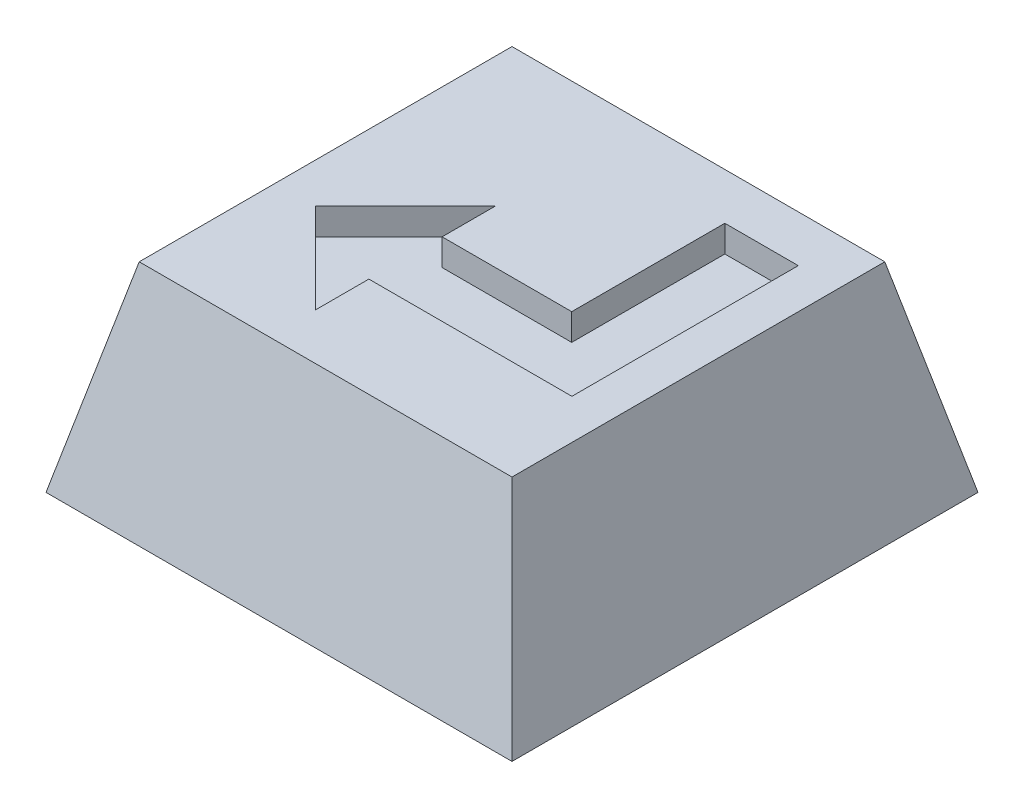
ISO-10303-21;
HEADER;
FILE_DESCRIPTION(('STEP AP214'),'2;1');
FILE_NAME('part.step','',(''),(''),'','','');
FILE_SCHEMA(('AUTOMOTIVE_DESIGN { 1 0 10303 214 1 1 1 1 }'));
ENDSEC;
DATA;
#1=APPLICATION_CONTEXT('core data for automotive mechanical design processes');
#2=APPLICATION_PROTOCOL_DEFINITION('international standard','automotive_design',2000,#1);
#3=PRODUCT_CONTEXT('',#1,'mechanical');
#4=PRODUCT('Part','Part','',(#3));
#5=PRODUCT_RELATED_PRODUCT_CATEGORY('part','',(#4));
#6=PRODUCT_DEFINITION_FORMATION('','',#4);
#7=PRODUCT_DEFINITION_CONTEXT('part definition',#1,'design');
#8=PRODUCT_DEFINITION('design','',#6,#7);
#9=PRODUCT_DEFINITION_SHAPE('','',#8);
#10=(LENGTH_UNIT() NAMED_UNIT(*) SI_UNIT(.MILLI.,.METRE.));
#11=(NAMED_UNIT(*) PLANE_ANGLE_UNIT() SI_UNIT($,.RADIAN.));
#12=(NAMED_UNIT(*) SI_UNIT($,.STERADIAN.) SOLID_ANGLE_UNIT());
#13=UNCERTAINTY_MEASURE_WITH_UNIT(LENGTH_MEASURE(1.E-05),#10,'distance_accuracy_value','');
#14=(GEOMETRIC_REPRESENTATION_CONTEXT(3) GLOBAL_UNCERTAINTY_ASSIGNED_CONTEXT((#13)) GLOBAL_UNIT_ASSIGNED_CONTEXT((#10,
#11,#12)) REPRESENTATION_CONTEXT('',''));
#15=CARTESIAN_POINT('',(0.,0.,0.));
#16=DIRECTION('',(0.,0.,1.));
#17=DIRECTION('',(1.,0.,0.));
#18=AXIS2_PLACEMENT_3D('',#15,#16,#17);
#19=CARTESIAN_POINT('',(0.,3.,0.));
#20=DIRECTION('',(0.,-1.,0.));
#21=DIRECTION('',(0.,0.,-1.));
#22=AXIS2_PLACEMENT_3D('',#19,#20,#21);
#23=PLANE('',#22);
#24=DIRECTION('',(0.,0.,-1.));
#25=VECTOR('',#24,1.);
#26=CARTESIAN_POINT('',(2.65,3.,0.));
#27=LINE('',#26,#25);
#28=CARTESIAN_POINT('',(2.65,3.,-1.4));
#29=VERTEX_POINT('',#28);
#30=CARTESIAN_POINT('',(2.65,3.,-2.2));
#31=VERTEX_POINT('',#30);
#32=EDGE_CURVE('E189',#29,#31,#27,.T.);
#33=ORIENTED_EDGE('',*,*,#32,.F.);
#34=DIRECTION('',(0.707106781186548,0.,0.707106781186548));
#35=VECTOR('',#34,1.);
#36=CARTESIAN_POINT('',(2.025,3.,-2.025));
#37=LINE('',#36,#35);
#38=CARTESIAN_POINT('',(1.3,3.,-2.75));
#39=VERTEX_POINT('',#38);
#40=EDGE_CURVE('E58',#39,#29,#37,.T.);
#41=ORIENTED_EDGE('',*,*,#40,.F.);
#42=DIRECTION('',(-0.707106781186547,0.,0.707106781186548));
#43=VECTOR('',#42,1.);
#44=CARTESIAN_POINT('',(-0.725,3.,-0.725));
#45=LINE('',#44,#43);
#46=CARTESIAN_POINT('',(2.65,3.,-4.1));
#47=VERTEX_POINT('',#46);
#48=EDGE_CURVE('E162',#47,#39,#45,.T.);
#49=ORIENTED_EDGE('',*,*,#48,.F.);
#50=CARTESIAN_POINT('',(2.65,3.,-3.3));
#51=VERTEX_POINT('',#50);
#52=EDGE_CURVE('E166',#51,#47,#27,.T.);
#53=ORIENTED_EDGE('',*,*,#52,.F.);
#54=DIRECTION('',(-1.,0.,0.));
#55=VECTOR('',#54,1.);
#56=CARTESIAN_POINT('',(0.,3.,-3.3));
#57=LINE('',#56,#55);
#58=CARTESIAN_POINT('',(4.5971024183662,3.,-3.3));
#59=VERTEX_POINT('',#58);
#60=EDGE_CURVE('E208',#59,#51,#57,.T.);
#61=ORIENTED_EDGE('',*,*,#60,.F.);
#62=DIRECTION('',(0.,0.,1.));
#63=VECTOR('',#62,1.);
#64=CARTESIAN_POINT('',(4.5971024183662,3.,0.));
#65=LINE('',#64,#63);
#66=CARTESIAN_POINT('',(4.5971024183662,3.,-5.6));
#67=VERTEX_POINT('',#66);
#68=EDGE_CURVE('E204',#67,#59,#65,.T.);
#69=ORIENTED_EDGE('',*,*,#68,.F.);
#70=DIRECTION('',(1.,0.,0.));
#71=VECTOR('',#70,1.);
#72=CARTESIAN_POINT('',(0.,3.,-5.6));
#73=LINE('',#72,#71);
#74=CARTESIAN_POINT('',(5.7,3.,-5.6));
#75=VERTEX_POINT('',#74);
#76=EDGE_CURVE('E200',#67,#75,#73,.T.);
#77=ORIENTED_EDGE('',*,*,#76,.T.);
#78=DIRECTION('',(0.,0.,1.));
#79=VECTOR('',#78,1.);
#80=CARTESIAN_POINT('',(5.7,3.,0.));
#81=LINE('',#80,#79);
#82=CARTESIAN_POINT('',(5.7,3.,-2.2));
#83=VERTEX_POINT('',#82);
#84=EDGE_CURVE('E196',#75,#83,#81,.T.);
#85=ORIENTED_EDGE('',*,*,#84,.T.);
#86=DIRECTION('',(-1.,0.,0.));
#87=VECTOR('',#86,1.);
#88=CARTESIAN_POINT('',(0.,3.,-2.2));
#89=LINE('',#88,#87);
#90=EDGE_CURVE('E192',#83,#31,#89,.T.);
#91=ORIENTED_EDGE('',*,*,#90,.T.);
#92=EDGE_LOOP('',(#33,#41,#49,#53,#61,#69,#77,#85,#91));
#93=FACE_BOUND('',#92,.T.);
#94=DIRECTION('',(-1.,0.,0.));
#95=VECTOR('',#94,1.);
#96=CARTESIAN_POINT('',(11.,3.,-0.7));
#97=LINE('',#96,#95);
#98=CARTESIAN_POINT('',(6.3,3.,-0.7));
#99=VERTEX_POINT('',#98);
#100=CARTESIAN_POINT('',(0.7,3.,-0.7));
#101=VERTEX_POINT('',#100);
#102=EDGE_CURVE('E65',#99,#101,#97,.T.);
#103=ORIENTED_EDGE('',*,*,#102,.F.);
#104=DIRECTION('',(0.,0.,1.));
#105=VECTOR('',#104,1.);
#106=CARTESIAN_POINT('',(6.3,3.,-7.));
#107=LINE('',#106,#105);
#108=CARTESIAN_POINT('',(6.3,3.,-6.3));
#109=VERTEX_POINT('',#108);
#110=EDGE_CURVE('E255',#109,#99,#107,.T.);
#111=ORIENTED_EDGE('',*,*,#110,.F.);
#112=DIRECTION('',(-1.,0.,0.));
#113=VECTOR('',#112,1.);
#114=CARTESIAN_POINT('',(11.,3.,-6.3));
#115=LINE('',#114,#113);
#116=CARTESIAN_POINT('',(0.699999999999998,3.,-6.3));
#117=VERTEX_POINT('',#116);
#118=EDGE_CURVE('E240',#109,#117,#115,.T.);
#119=ORIENTED_EDGE('',*,*,#118,.T.);
#120=DIRECTION('',(0.,0.,1.));
#121=VECTOR('',#120,1.);
#122=CARTESIAN_POINT('',(0.7,3.,-7.));
#123=LINE('',#122,#121);
#124=EDGE_CURVE('E256',#117,#101,#123,.T.);
#125=ORIENTED_EDGE('',*,*,#124,.T.);
#126=EDGE_LOOP('',(#103,#111,#119,#125));
#127=FACE_BOUND('',#126,.T.);
#128=ADVANCED_FACE('F42',(#93,#127),#23,.F.);
#129=CARTESIAN_POINT('',(7.,0.,-7.));
#130=DIRECTION('',(-0.973841209741793,-0.227229615606418,0.));
#131=DIRECTION('',(0.227229615606418,-0.973841209741793,0.));
#132=AXIS2_PLACEMENT_3D('',#129,#130,#131);
#133=PLANE('',#132);
#134=DIRECTION('',(-0.221581128241521,0.949633406749377,-0.221581128241521));
#135=VECTOR('',#134,1.);
#136=CARTESIAN_POINT('',(6.6563126252505,1.47294589178357,-0.343687374749499));
#137=LINE('',#136,#135);
#138=CARTESIAN_POINT('',(7.,0.,0.));
#139=VERTEX_POINT('',#138);
#140=EDGE_CURVE('E252',#139,#99,#137,.T.);
#141=ORIENTED_EDGE('',*,*,#140,.F.);
#142=DIRECTION('',(0.,0.,-1.));
#143=VECTOR('',#142,1.);
#144=CARTESIAN_POINT('',(7.,0.,0.));
#145=LINE('',#144,#143);
#146=CARTESIAN_POINT('',(7.,0.,-7.));
#147=VERTEX_POINT('',#146);
#148=EDGE_CURVE('E270',#139,#147,#145,.T.);
#149=ORIENTED_EDGE('',*,*,#148,.T.);
#150=DIRECTION('',(0.221581128241521,-0.949633406749377,-0.221581128241521));
#151=VECTOR('',#150,1.);
#152=CARTESIAN_POINT('',(7.,0.,-7.));
#153=LINE('',#152,#151);
#154=EDGE_CURVE('E246',#109,#147,#153,.T.);
#155=ORIENTED_EDGE('',*,*,#154,.F.);
#156=ORIENTED_EDGE('',*,*,#110,.T.);
#157=EDGE_LOOP('',(#141,#149,#155,#156));
#158=FACE_BOUND('',#157,.T.);
#159=ADVANCED_FACE('F294',(#158),#133,.F.);
#160=CARTESIAN_POINT('',(0.,0.,-7.));
#161=DIRECTION('',(0.973841209741793,-0.227229615606418,0.));
#162=DIRECTION('',(0.227229615606418,0.973841209741793,0.));
#163=AXIS2_PLACEMENT_3D('',#160,#161,#162);
#164=PLANE('',#163);
#165=DIRECTION('',(-0.221581128241521,-0.949633406749378,0.221581128241521));
#166=VECTOR('',#165,1.);
#167=CARTESIAN_POINT('',(0.343687374749499,1.47294589178357,-0.3436873747495));
#168=LINE('',#167,#166);
#169=CARTESIAN_POINT('',(0.,0.,0.));
#170=VERTEX_POINT('',#169);
#171=EDGE_CURVE('E11',#101,#170,#168,.T.);
#172=ORIENTED_EDGE('',*,*,#171,.F.);
#173=ORIENTED_EDGE('',*,*,#124,.F.);
#174=DIRECTION('',(0.221581128241521,0.949633406749377,0.221581128241521));
#175=VECTOR('',#174,1.);
#176=CARTESIAN_POINT('',(0.,0.,-7.));
#177=LINE('',#176,#175);
#178=CARTESIAN_POINT('',(0.,0.,-7.));
#179=VERTEX_POINT('',#178);
#180=EDGE_CURVE('E51',#179,#117,#177,.T.);
#181=ORIENTED_EDGE('',*,*,#180,.F.);
#182=DIRECTION('',(0.,0.,1.));
#183=VECTOR('',#182,1.);
#184=CARTESIAN_POINT('',(0.,0.,0.));
#185=LINE('',#184,#183);
#186=EDGE_CURVE('E260',#179,#170,#185,.T.);
#187=ORIENTED_EDGE('',*,*,#186,.T.);
#188=EDGE_LOOP('',(#172,#173,#181,#187));
#189=FACE_BOUND('',#188,.T.);
#190=ADVANCED_FACE('F287',(#189),#164,.F.);
#191=CARTESIAN_POINT('',(0.,0.,0.));
#192=DIRECTION('',(0.,-1.,0.));
#193=DIRECTION('',(0.,0.,-1.));
#194=AXIS2_PLACEMENT_3D('',#191,#192,#193);
#195=PLANE('',#194);
#196=CARTESIAN_POINT('',(3.5,0.,-3.5));
#197=DIRECTION('',(0.,-1.,0.));
#198=DIRECTION('',(0.,0.,-1.));
#199=AXIS2_PLACEMENT_3D('',#196,#197,#198);
#200=CIRCLE('',#199,1.8);
#201=CARTESIAN_POINT('',(3.5,0.,-5.3));
#202=VERTEX_POINT('',#201);
#203=EDGE_CURVE('E215',#202,#202,#200,.T.);
#204=ORIENTED_EDGE('',*,*,#203,.F.);
#205=EDGE_LOOP('',(#204));
#206=FACE_BOUND('',#205,.T.);
#207=ORIENTED_EDGE('',*,*,#186,.F.);
#208=DIRECTION('',(-1.,0.,0.));
#209=VECTOR('',#208,1.);
#210=CARTESIAN_POINT('',(0.,0.,-7.));
#211=LINE('',#210,#209);
#212=EDGE_CURVE('E274',#147,#179,#211,.T.);
#213=ORIENTED_EDGE('',*,*,#212,.F.);
#214=ORIENTED_EDGE('',*,*,#148,.F.);
#215=DIRECTION('',(1.,0.,0.));
#216=VECTOR('',#215,1.);
#217=CARTESIAN_POINT('',(0.,0.,0.));
#218=LINE('',#217,#216);
#219=EDGE_CURVE('E267',#170,#139,#218,.T.);
#220=ORIENTED_EDGE('',*,*,#219,.F.);
#221=EDGE_LOOP('',(#207,#213,#214,#220));
#222=FACE_BOUND('',#221,.T.);
#223=ADVANCED_FACE('F44',(#206,#222),#195,.T.);
#224=CARTESIAN_POINT('',(11.,3.,-6.3));
#225=DIRECTION('',(0.,0.227229615606418,-0.973841209741793));
#226=DIRECTION('',(0.,0.973841209741793,0.227229615606418));
#227=AXIS2_PLACEMENT_3D('',#224,#225,#226);
#228=PLANE('',#227);
#229=ORIENTED_EDGE('',*,*,#154,.T.);
#230=ORIENTED_EDGE('',*,*,#212,.T.);
#231=ORIENTED_EDGE('',*,*,#180,.T.);
#232=ORIENTED_EDGE('',*,*,#118,.F.);
#233=EDGE_LOOP('',(#229,#230,#231,#232));
#234=FACE_BOUND('',#233,.T.);
#235=ADVANCED_FACE('F279',(#234),#228,.T.);
#236=CARTESIAN_POINT('',(11.,0.,0.));
#237=DIRECTION('',(0.,0.227229615606418,0.973841209741793));
#238=DIRECTION('',(0.,-0.973841209741793,0.227229615606418));
#239=AXIS2_PLACEMENT_3D('',#236,#237,#238);
#240=PLANE('',#239);
#241=ORIENTED_EDGE('',*,*,#140,.T.);
#242=ORIENTED_EDGE('',*,*,#102,.T.);
#243=ORIENTED_EDGE('',*,*,#171,.T.);
#244=ORIENTED_EDGE('',*,*,#219,.T.);
#245=EDGE_LOOP('',(#241,#242,#243,#244));
#246=FACE_BOUND('',#245,.T.);
#247=ADVANCED_FACE('F289',(#246),#240,.T.);
#248=CARTESIAN_POINT('',(3.5,0.8,-3.5));
#249=DIRECTION('',(0.,-1.,0.));
#250=DIRECTION('',(0.,0.,-1.));
#251=AXIS2_PLACEMENT_3D('',#248,#249,#250);
#252=CYLINDRICAL_SURFACE('',#251,1.8);
#253=CARTESIAN_POINT('',(3.5,0.8,-3.5));
#254=DIRECTION('',(0.,-1.,0.));
#255=DIRECTION('',(0.,0.,-1.));
#256=AXIS2_PLACEMENT_3D('',#253,#254,#255);
#257=CIRCLE('',#256,1.8);
#258=CARTESIAN_POINT('',(3.5,0.8,-5.3));
#259=VERTEX_POINT('',#258);
#260=EDGE_CURVE('E236',#259,#259,#257,.T.);
#261=ORIENTED_EDGE('',*,*,#260,.F.);
#262=EDGE_LOOP('',(#261));
#263=FACE_BOUND('',#262,.T.);
#264=ORIENTED_EDGE('',*,*,#203,.T.);
#265=EDGE_LOOP('',(#264));
#266=FACE_BOUND('',#265,.T.);
#267=ADVANCED_FACE('F315',(#263,#266),#252,.F.);
#268=CARTESIAN_POINT('',(3.5,0.8,-3.5));
#269=DIRECTION('',(0.,-1.,0.));
#270=DIRECTION('',(0.,0.,-1.));
#271=AXIS2_PLACEMENT_3D('',#268,#269,#270);
#272=PLANE('',#271);
#273=ORIENTED_EDGE('',*,*,#260,.T.);
#274=EDGE_LOOP('',(#273));
#275=FACE_BOUND('',#274,.T.);
#276=ADVANCED_FACE('F318',(#275),#272,.T.);
#277=CARTESIAN_POINT('',(2.025,2.6,-2.025));
#278=DIRECTION('',(-0.707106781186548,0.,0.707106781186548));
#279=DIRECTION('',(0.707106781186548,0.,0.707106781186548));
#280=AXIS2_PLACEMENT_3D('',#277,#278,#279);
#281=PLANE('',#280);
#282=ORIENTED_EDGE('',*,*,#40,.T.);
#283=DIRECTION('',(0.,1.,0.));
#284=VECTOR('',#283,1.);
#285=CARTESIAN_POINT('',(2.65,2.6,-1.4));
#286=LINE('',#285,#284);
#287=CARTESIAN_POINT('',(2.65,2.6,-1.4));
#288=VERTEX_POINT('',#287);
#289=EDGE_CURVE('E135',#288,#29,#286,.T.);
#290=ORIENTED_EDGE('',*,*,#289,.F.);
#291=DIRECTION('',(0.707106781186548,0.,0.707106781186548));
#292=VECTOR('',#291,1.);
#293=CARTESIAN_POINT('',(2.025,2.6,-2.025));
#294=LINE('',#293,#292);
#295=CARTESIAN_POINT('',(1.3,2.6,-2.75));
#296=VERTEX_POINT('',#295);
#297=EDGE_CURVE('E139',#296,#288,#294,.T.);
#298=ORIENTED_EDGE('',*,*,#297,.F.);
#299=DIRECTION('',(0.,1.,0.));
#300=VECTOR('',#299,1.);
#301=CARTESIAN_POINT('',(1.3,2.6,-2.75));
#302=LINE('',#301,#300);
#303=EDGE_CURVE('E212',#296,#39,#302,.T.);
#304=ORIENTED_EDGE('',*,*,#303,.T.);
#305=EDGE_LOOP('',(#282,#290,#298,#304));
#306=FACE_BOUND('',#305,.T.);
#307=ADVANCED_FACE('F137',(#306),#281,.F.);
#308=CARTESIAN_POINT('',(-0.725,2.6,-0.725));
#309=DIRECTION('',(-0.707106781186548,0.,-0.707106781186547));
#310=DIRECTION('',(-0.707106781186547,0.,0.707106781186548));
#311=AXIS2_PLACEMENT_3D('',#308,#309,#310);
#312=PLANE('',#311);
#313=ORIENTED_EDGE('',*,*,#48,.T.);
#314=ORIENTED_EDGE('',*,*,#303,.F.);
#315=DIRECTION('',(-0.707106781186547,0.,0.707106781186548));
#316=VECTOR('',#315,1.);
#317=CARTESIAN_POINT('',(-0.725,2.6,-0.725));
#318=LINE('',#317,#316);
#319=CARTESIAN_POINT('',(2.65,2.6,-4.1));
#320=VERTEX_POINT('',#319);
#321=EDGE_CURVE('E146',#320,#296,#318,.T.);
#322=ORIENTED_EDGE('',*,*,#321,.F.);
#323=DIRECTION('',(0.,1.,0.));
#324=VECTOR('',#323,1.);
#325=CARTESIAN_POINT('',(2.65,2.6,-4.1));
#326=LINE('',#325,#324);
#327=EDGE_CURVE('E216',#320,#47,#326,.T.);
#328=ORIENTED_EDGE('',*,*,#327,.T.);
#329=EDGE_LOOP('',(#313,#314,#322,#328));
#330=FACE_BOUND('',#329,.T.);
#331=ADVANCED_FACE('F325',(#330),#312,.F.);
#332=CARTESIAN_POINT('',(2.65,2.6,0.));
#333=DIRECTION('',(1.,0.,0.));
#334=DIRECTION('',(0.,0.,-1.));
#335=AXIS2_PLACEMENT_3D('',#332,#333,#334);
#336=PLANE('',#335);
#337=ORIENTED_EDGE('',*,*,#52,.T.);
#338=ORIENTED_EDGE('',*,*,#327,.F.);
#339=DIRECTION('',(0.,0.,-1.));
#340=VECTOR('',#339,1.);
#341=CARTESIAN_POINT('',(2.65,2.6,0.));
#342=LINE('',#341,#340);
#343=CARTESIAN_POINT('',(2.65,2.6,-3.3));
#344=VERTEX_POINT('',#343);
#345=EDGE_CURVE('E157',#344,#320,#342,.T.);
#346=ORIENTED_EDGE('',*,*,#345,.F.);
#347=DIRECTION('',(0.,1.,0.));
#348=VECTOR('',#347,1.);
#349=CARTESIAN_POINT('',(2.65,2.6,-3.3));
#350=LINE('',#349,#348);
#351=EDGE_CURVE('E219',#344,#51,#350,.T.);
#352=ORIENTED_EDGE('',*,*,#351,.T.);
#353=EDGE_LOOP('',(#337,#338,#346,#352));
#354=FACE_BOUND('',#353,.T.);
#355=ADVANCED_FACE('F345',(#354),#336,.F.);
#356=CARTESIAN_POINT('',(0.,2.6,-3.3));
#357=DIRECTION('',(0.,0.,-1.));
#358=DIRECTION('',(-1.,0.,0.));
#359=AXIS2_PLACEMENT_3D('',#356,#357,#358);
#360=PLANE('',#359);
#361=ORIENTED_EDGE('',*,*,#60,.T.);
#362=ORIENTED_EDGE('',*,*,#351,.F.);
#363=DIRECTION('',(-1.,0.,0.));
#364=VECTOR('',#363,1.);
#365=CARTESIAN_POINT('',(0.,2.6,-3.3));
#366=LINE('',#365,#364);
#367=CARTESIAN_POINT('',(4.5971024183662,2.6,-3.3));
#368=VERTEX_POINT('',#367);
#369=EDGE_CURVE('E181',#368,#344,#366,.T.);
#370=ORIENTED_EDGE('',*,*,#369,.F.);
#371=DIRECTION('',(0.,1.,0.));
#372=VECTOR('',#371,1.);
#373=CARTESIAN_POINT('',(4.5971024183662,2.6,-3.3));
#374=LINE('',#373,#372);
#375=EDGE_CURVE('E222',#368,#59,#374,.T.);
#376=ORIENTED_EDGE('',*,*,#375,.T.);
#377=EDGE_LOOP('',(#361,#362,#370,#376));
#378=FACE_BOUND('',#377,.T.);
#379=ADVANCED_FACE('F341',(#378),#360,.F.);
#380=CARTESIAN_POINT('',(4.5971024183662,2.6,0.));
#381=DIRECTION('',(-1.,0.,0.));
#382=DIRECTION('',(0.,0.,1.));
#383=AXIS2_PLACEMENT_3D('',#380,#381,#382);
#384=PLANE('',#383);
#385=ORIENTED_EDGE('',*,*,#68,.T.);
#386=ORIENTED_EDGE('',*,*,#375,.F.);
#387=DIRECTION('',(0.,0.,1.));
#388=VECTOR('',#387,1.);
#389=CARTESIAN_POINT('',(4.5971024183662,2.6,0.));
#390=LINE('',#389,#388);
#391=CARTESIAN_POINT('',(4.5971024183662,2.6,-5.6));
#392=VERTEX_POINT('',#391);
#393=EDGE_CURVE('E177',#392,#368,#390,.T.);
#394=ORIENTED_EDGE('',*,*,#393,.F.);
#395=DIRECTION('',(0.,1.,0.));
#396=VECTOR('',#395,1.);
#397=CARTESIAN_POINT('',(4.5971024183662,2.6,-5.6));
#398=LINE('',#397,#396);
#399=EDGE_CURVE('E225',#392,#67,#398,.T.);
#400=ORIENTED_EDGE('',*,*,#399,.T.);
#401=EDGE_LOOP('',(#385,#386,#394,#400));
#402=FACE_BOUND('',#401,.T.);
#403=ADVANCED_FACE('F337',(#402),#384,.F.);
#404=CARTESIAN_POINT('',(0.,2.6,-5.6));
#405=DIRECTION('',(0.,0.,1.));
#406=DIRECTION('',(1.,0.,0.));
#407=AXIS2_PLACEMENT_3D('',#404,#405,#406);
#408=PLANE('',#407);
#409=ORIENTED_EDGE('',*,*,#76,.F.);
#410=ORIENTED_EDGE('',*,*,#399,.F.);
#411=DIRECTION('',(1.,0.,0.));
#412=VECTOR('',#411,1.);
#413=CARTESIAN_POINT('',(0.,2.6,-5.6));
#414=LINE('',#413,#412);
#415=CARTESIAN_POINT('',(5.7,2.6,-5.6));
#416=VERTEX_POINT('',#415);
#417=EDGE_CURVE('E174',#392,#416,#414,.T.);
#418=ORIENTED_EDGE('',*,*,#417,.T.);
#419=DIRECTION('',(0.,1.,0.));
#420=VECTOR('',#419,1.);
#421=CARTESIAN_POINT('',(5.7,2.6,-5.6));
#422=LINE('',#421,#420);
#423=EDGE_CURVE('E228',#416,#75,#422,.T.);
#424=ORIENTED_EDGE('',*,*,#423,.T.);
#425=EDGE_LOOP('',(#409,#410,#418,#424));
#426=FACE_BOUND('',#425,.T.);
#427=ADVANCED_FACE('F333',(#426),#408,.T.);
#428=CARTESIAN_POINT('',(5.7,2.6,0.));
#429=DIRECTION('',(-1.,0.,0.));
#430=DIRECTION('',(0.,0.,1.));
#431=AXIS2_PLACEMENT_3D('',#428,#429,#430);
#432=PLANE('',#431);
#433=ORIENTED_EDGE('',*,*,#84,.F.);
#434=ORIENTED_EDGE('',*,*,#423,.F.);
#435=DIRECTION('',(0.,0.,1.));
#436=VECTOR('',#435,1.);
#437=CARTESIAN_POINT('',(5.7,2.6,0.));
#438=LINE('',#437,#436);
#439=CARTESIAN_POINT('',(5.7,2.6,-2.2));
#440=VERTEX_POINT('',#439);
#441=EDGE_CURVE('E171',#416,#440,#438,.T.);
#442=ORIENTED_EDGE('',*,*,#441,.T.);
#443=DIRECTION('',(0.,1.,0.));
#444=VECTOR('',#443,1.);
#445=CARTESIAN_POINT('',(5.7,2.6,-2.2));
#446=LINE('',#445,#444);
#447=EDGE_CURVE('E231',#440,#83,#446,.T.);
#448=ORIENTED_EDGE('',*,*,#447,.T.);
#449=EDGE_LOOP('',(#433,#434,#442,#448));
#450=FACE_BOUND('',#449,.T.);
#451=ADVANCED_FACE('F329',(#450),#432,.T.);
#452=CARTESIAN_POINT('',(0.,2.6,-2.2));
#453=DIRECTION('',(0.,0.,-1.));
#454=DIRECTION('',(-1.,0.,0.));
#455=AXIS2_PLACEMENT_3D('',#452,#453,#454);
#456=PLANE('',#455);
#457=ORIENTED_EDGE('',*,*,#90,.F.);
#458=ORIENTED_EDGE('',*,*,#447,.F.);
#459=DIRECTION('',(-1.,0.,0.));
#460=VECTOR('',#459,1.);
#461=CARTESIAN_POINT('',(0.,2.6,-2.2));
#462=LINE('',#461,#460);
#463=CARTESIAN_POINT('',(2.65,2.6,-2.2));
#464=VERTEX_POINT('',#463);
#465=EDGE_CURVE('E155',#440,#464,#462,.T.);
#466=ORIENTED_EDGE('',*,*,#465,.T.);
#467=DIRECTION('',(0.,1.,0.));
#468=VECTOR('',#467,1.);
#469=CARTESIAN_POINT('',(2.65,2.6,-2.2));
#470=LINE('',#469,#468);
#471=EDGE_CURVE('E145',#464,#31,#470,.T.);
#472=ORIENTED_EDGE('',*,*,#471,.T.);
#473=EDGE_LOOP('',(#457,#458,#466,#472));
#474=FACE_BOUND('',#473,.T.);
#475=ADVANCED_FACE('F326',(#474),#456,.T.);
#476=ORIENTED_EDGE('',*,*,#32,.T.);
#477=ORIENTED_EDGE('',*,*,#471,.F.);
#478=EDGE_CURVE('E150',#288,#464,#342,.T.);
#479=ORIENTED_EDGE('',*,*,#478,.F.);
#480=ORIENTED_EDGE('',*,*,#289,.T.);
#481=EDGE_LOOP('',(#476,#477,#479,#480));
#482=FACE_BOUND('',#481,.T.);
#483=ADVANCED_FACE('F151',(#482),#336,.F.);
#484=CARTESIAN_POINT('',(0.,2.6,0.));
#485=DIRECTION('',(0.,1.,0.));
#486=DIRECTION('',(0.,0.,1.));
#487=AXIS2_PLACEMENT_3D('',#484,#485,#486);
#488=PLANE('',#487);
#489=ORIENTED_EDGE('',*,*,#297,.T.);
#490=ORIENTED_EDGE('',*,*,#478,.T.);
#491=ORIENTED_EDGE('',*,*,#465,.F.);
#492=ORIENTED_EDGE('',*,*,#441,.F.);
#493=ORIENTED_EDGE('',*,*,#417,.F.);
#494=ORIENTED_EDGE('',*,*,#393,.T.);
#495=ORIENTED_EDGE('',*,*,#369,.T.);
#496=ORIENTED_EDGE('',*,*,#345,.T.);
#497=ORIENTED_EDGE('',*,*,#321,.T.);
#498=EDGE_LOOP('',(#489,#490,#491,#492,#493,#494,#495,#496,#497));
#499=FACE_BOUND('',#498,.T.);
#500=ADVANCED_FACE('F158',(#499),#488,.T.);
#501=CLOSED_SHELL('',(#128,#159,#190,#223,#235,#247,#267,#276,#307,#331,#355,#379,#403,#427,
#451,#475,#483,#500));
#502=MANIFOLD_SOLID_BREP('B2',#501);
#503=ADVANCED_BREP_SHAPE_REPRESENTATION('',(#18,#502),#14);
#504=SHAPE_DEFINITION_REPRESENTATION(#9,#503);
ENDSEC;
END-ISO-10303-21;
